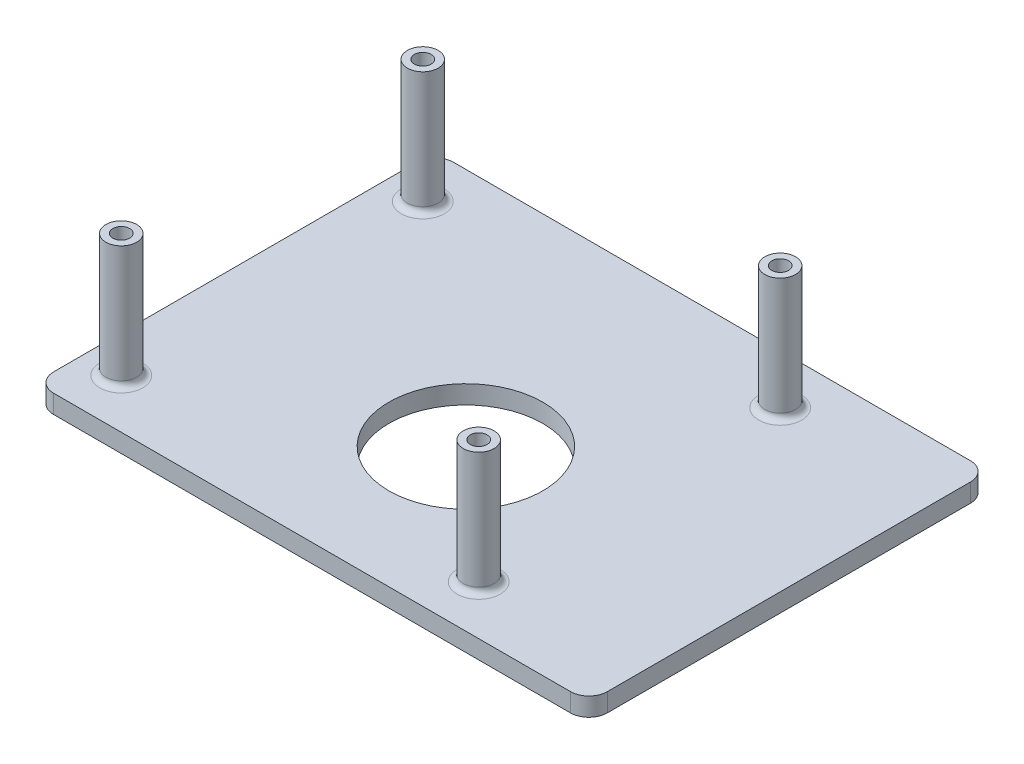
ISO-10303-21;
HEADER;
FILE_DESCRIPTION(('STEP AP214'),'2;1');
FILE_NAME('part.step','',(''),(''),'','','');
FILE_SCHEMA(('AUTOMOTIVE_DESIGN { 1 0 10303 214 1 1 1 1 }'));
ENDSEC;
DATA;
#1=APPLICATION_CONTEXT('core data for automotive mechanical design processes');
#2=APPLICATION_PROTOCOL_DEFINITION('international standard','automotive_design',2000,#1);
#3=PRODUCT_CONTEXT('',#1,'mechanical');
#4=PRODUCT('Part','Part','',(#3));
#5=PRODUCT_RELATED_PRODUCT_CATEGORY('part','',(#4));
#6=PRODUCT_DEFINITION_FORMATION('','',#4);
#7=PRODUCT_DEFINITION_CONTEXT('part definition',#1,'design');
#8=PRODUCT_DEFINITION('design','',#6,#7);
#9=PRODUCT_DEFINITION_SHAPE('','',#8);
#10=(LENGTH_UNIT() NAMED_UNIT(*) SI_UNIT(.MILLI.,.METRE.));
#11=(NAMED_UNIT(*) PLANE_ANGLE_UNIT() SI_UNIT($,.RADIAN.));
#12=(NAMED_UNIT(*) SI_UNIT($,.STERADIAN.) SOLID_ANGLE_UNIT());
#13=UNCERTAINTY_MEASURE_WITH_UNIT(LENGTH_MEASURE(1.E-05),#10,'distance_accuracy_value','');
#14=(GEOMETRIC_REPRESENTATION_CONTEXT(3) GLOBAL_UNCERTAINTY_ASSIGNED_CONTEXT((#13)) GLOBAL_UNIT_ASSIGNED_CONTEXT((#10,
#11,#12)) REPRESENTATION_CONTEXT('',''));
#15=CARTESIAN_POINT('',(0.,0.,0.));
#16=DIRECTION('',(0.,0.,1.));
#17=DIRECTION('',(1.,0.,0.));
#18=AXIS2_PLACEMENT_3D('',#15,#16,#17);
#19=CARTESIAN_POINT('',(-45.,3.,32.5));
#20=DIRECTION('',(0.,0.,-1.));
#21=DIRECTION('',(-1.,0.,0.));
#22=AXIS2_PLACEMENT_3D('',#19,#20,#21);
#23=PLANE('',#22);
#24=DIRECTION('',(1.,0.,0.));
#25=VECTOR('',#24,1.);
#26=CARTESIAN_POINT('',(-45.,3.,32.5));
#27=LINE('',#26,#25);
#28=CARTESIAN_POINT('',(-42.,3.,32.5));
#29=VERTEX_POINT('',#28);
#30=CARTESIAN_POINT('',(42.,3.,32.5));
#31=VERTEX_POINT('',#30);
#32=EDGE_CURVE('E135',#29,#31,#27,.T.);
#33=ORIENTED_EDGE('',*,*,#32,.F.);
#34=DIRECTION('',(0.,-1.,0.));
#35=VECTOR('',#34,1.);
#36=CARTESIAN_POINT('',(-42.,3.,32.5));
#37=LINE('',#36,#35);
#38=CARTESIAN_POINT('',(-42.,0.,32.5));
#39=VERTEX_POINT('',#38);
#40=EDGE_CURVE('E163',#29,#39,#37,.T.);
#41=ORIENTED_EDGE('',*,*,#40,.T.);
#42=DIRECTION('',(1.,0.,0.));
#43=VECTOR('',#42,1.);
#44=CARTESIAN_POINT('',(-45.,0.,32.5));
#45=LINE('',#44,#43);
#46=CARTESIAN_POINT('',(42.,0.,32.5));
#47=VERTEX_POINT('',#46);
#48=EDGE_CURVE('E137',#39,#47,#45,.T.);
#49=ORIENTED_EDGE('',*,*,#48,.T.);
#50=DIRECTION('',(0.,-1.,0.));
#51=VECTOR('',#50,1.);
#52=CARTESIAN_POINT('',(42.,3.,32.5));
#53=LINE('',#52,#51);
#54=EDGE_CURVE('E161',#47,#31,#53,.F.);
#55=ORIENTED_EDGE('',*,*,#54,.T.);
#56=EDGE_LOOP('',(#33,#41,#49,#55));
#57=FACE_BOUND('',#56,.T.);
#58=ADVANCED_FACE('F40',(#57),#23,.F.);
#59=CARTESIAN_POINT('',(45.,3.,32.5));
#60=DIRECTION('',(-1.,0.,0.));
#61=DIRECTION('',(0.,0.,1.));
#62=AXIS2_PLACEMENT_3D('',#59,#60,#61);
#63=PLANE('',#62);
#64=DIRECTION('',(0.,0.,-1.));
#65=VECTOR('',#64,1.);
#66=CARTESIAN_POINT('',(45.,0.,32.5));
#67=LINE('',#66,#65);
#68=CARTESIAN_POINT('',(45.,0.,29.5));
#69=VERTEX_POINT('',#68);
#70=CARTESIAN_POINT('',(45.,0.,-29.5));
#71=VERTEX_POINT('',#70);
#72=EDGE_CURVE('E133',#69,#71,#67,.T.);
#73=ORIENTED_EDGE('',*,*,#72,.T.);
#74=DIRECTION('',(0.,-1.,0.));
#75=VECTOR('',#74,1.);
#76=CARTESIAN_POINT('',(45.,3.,-29.5));
#77=LINE('',#76,#75);
#78=CARTESIAN_POINT('',(45.,3.,-29.5));
#79=VERTEX_POINT('',#78);
#80=EDGE_CURVE('E112',#71,#79,#77,.F.);
#81=ORIENTED_EDGE('',*,*,#80,.T.);
#82=DIRECTION('',(0.,0.,-1.));
#83=VECTOR('',#82,1.);
#84=CARTESIAN_POINT('',(45.,3.,32.5));
#85=LINE('',#84,#83);
#86=CARTESIAN_POINT('',(45.,3.,29.5));
#87=VERTEX_POINT('',#86);
#88=EDGE_CURVE('E265',#87,#79,#85,.T.);
#89=ORIENTED_EDGE('',*,*,#88,.F.);
#90=DIRECTION('',(0.,-1.,0.));
#91=VECTOR('',#90,1.);
#92=CARTESIAN_POINT('',(45.,3.,29.5));
#93=LINE('',#92,#91);
#94=EDGE_CURVE('E117',#87,#69,#93,.T.);
#95=ORIENTED_EDGE('',*,*,#94,.T.);
#96=EDGE_LOOP('',(#73,#81,#89,#95));
#97=FACE_BOUND('',#96,.T.);
#98=ADVANCED_FACE('F203',(#97),#63,.F.);
#99=CARTESIAN_POINT('',(-45.,3.,-32.5));
#100=DIRECTION('',(0.,0.,1.));
#101=DIRECTION('',(1.,0.,0.));
#102=AXIS2_PLACEMENT_3D('',#99,#100,#101);
#103=PLANE('',#102);
#104=DIRECTION('',(-1.,0.,0.));
#105=VECTOR('',#104,1.);
#106=CARTESIAN_POINT('',(-45.,3.,-32.5));
#107=LINE('',#106,#105);
#108=CARTESIAN_POINT('',(42.,3.,-32.5));
#109=VERTEX_POINT('',#108);
#110=CARTESIAN_POINT('',(-42.,3.,-32.5));
#111=VERTEX_POINT('',#110);
#112=EDGE_CURVE('E126',#109,#111,#107,.T.);
#113=ORIENTED_EDGE('',*,*,#112,.F.);
#114=DIRECTION('',(0.,-1.,0.));
#115=VECTOR('',#114,1.);
#116=CARTESIAN_POINT('',(42.,3.,-32.5));
#117=LINE('',#116,#115);
#118=CARTESIAN_POINT('',(42.,0.,-32.5));
#119=VERTEX_POINT('',#118);
#120=EDGE_CURVE('E111',#109,#119,#117,.T.);
#121=ORIENTED_EDGE('',*,*,#120,.T.);
#122=DIRECTION('',(-1.,0.,0.));
#123=VECTOR('',#122,1.);
#124=CARTESIAN_POINT('',(-45.,0.,-32.5));
#125=LINE('',#124,#123);
#126=CARTESIAN_POINT('',(-42.,0.,-32.5));
#127=VERTEX_POINT('',#126);
#128=EDGE_CURVE('E124',#119,#127,#125,.T.);
#129=ORIENTED_EDGE('',*,*,#128,.T.);
#130=DIRECTION('',(0.,-1.,0.));
#131=VECTOR('',#130,1.);
#132=CARTESIAN_POINT('',(-42.,3.,-32.5));
#133=LINE('',#132,#131);
#134=EDGE_CURVE('E128',#127,#111,#133,.F.);
#135=ORIENTED_EDGE('',*,*,#134,.T.);
#136=EDGE_LOOP('',(#113,#121,#129,#135));
#137=FACE_BOUND('',#136,.T.);
#138=ADVANCED_FACE('F123',(#137),#103,.F.);
#139=CARTESIAN_POINT('',(-45.,3.,32.5));
#140=DIRECTION('',(1.,0.,0.));
#141=DIRECTION('',(0.,0.,-1.));
#142=AXIS2_PLACEMENT_3D('',#139,#140,#141);
#143=PLANE('',#142);
#144=DIRECTION('',(0.,0.,1.));
#145=VECTOR('',#144,1.);
#146=CARTESIAN_POINT('',(-45.,3.,32.5));
#147=LINE('',#146,#145);
#148=CARTESIAN_POINT('',(-45.,3.,-29.5));
#149=VERTEX_POINT('',#148);
#150=CARTESIAN_POINT('',(-45.,3.,29.5));
#151=VERTEX_POINT('',#150);
#152=EDGE_CURVE('E141',#149,#151,#147,.T.);
#153=ORIENTED_EDGE('',*,*,#152,.F.);
#154=DIRECTION('',(0.,-1.,0.));
#155=VECTOR('',#154,1.);
#156=CARTESIAN_POINT('',(-45.,3.,-29.5));
#157=LINE('',#156,#155);
#158=CARTESIAN_POINT('',(-45.,0.,-29.5));
#159=VERTEX_POINT('',#158);
#160=EDGE_CURVE('E158',#149,#159,#157,.T.);
#161=ORIENTED_EDGE('',*,*,#160,.T.);
#162=DIRECTION('',(0.,0.,1.));
#163=VECTOR('',#162,1.);
#164=CARTESIAN_POINT('',(-45.,0.,32.5));
#165=LINE('',#164,#163);
#166=CARTESIAN_POINT('',(-45.,0.,29.5));
#167=VERTEX_POINT('',#166);
#168=EDGE_CURVE('E132',#159,#167,#165,.T.);
#169=ORIENTED_EDGE('',*,*,#168,.T.);
#170=DIRECTION('',(0.,-1.,0.));
#171=VECTOR('',#170,1.);
#172=CARTESIAN_POINT('',(-45.,3.,29.5));
#173=LINE('',#172,#171);
#174=EDGE_CURVE('E55',#167,#151,#173,.F.);
#175=ORIENTED_EDGE('',*,*,#174,.T.);
#176=EDGE_LOOP('',(#153,#161,#169,#175));
#177=FACE_BOUND('',#176,.T.);
#178=ADVANCED_FACE('F278',(#177),#143,.F.);
#179=CARTESIAN_POINT('',(0.,3.,0.));
#180=DIRECTION('',(0.,1.,0.));
#181=DIRECTION('',(0.,0.,1.));
#182=AXIS2_PLACEMENT_3D('',#179,#180,#181);
#183=PLANE('',#182);
#184=CARTESIAN_POINT('',(-1.00000000000001,3.,6.50000000000001));
#185=DIRECTION('',(0.,1.,0.));
#186=DIRECTION('',(0.,0.,1.));
#187=AXIS2_PLACEMENT_3D('',#184,#185,#186);
#188=CIRCLE('',#187,12.5003479994746);
#189=CARTESIAN_POINT('',(-1.00000000000001,3.,19.0003479994746));
#190=VERTEX_POINT('',#189);
#191=EDGE_CURVE('E337',#190,#190,#188,.T.);
#192=ORIENTED_EDGE('',*,*,#191,.F.);
#193=EDGE_LOOP('',(#192));
#194=FACE_BOUND('',#193,.T.);
#195=CARTESIAN_POINT('',(-39.,3.,24.5));
#196=DIRECTION('',(0.,1.,0.));
#197=DIRECTION('',(0.,0.,1.));
#198=AXIS2_PLACEMENT_3D('',#195,#196,#197);
#199=CIRCLE('',#198,3.5);
#200=CARTESIAN_POINT('',(-39.,3.,28.));
#201=VERTEX_POINT('',#200);
#202=EDGE_CURVE('E178',#201,#201,#199,.F.);
#203=ORIENTED_EDGE('',*,*,#202,.T.);
#204=EDGE_LOOP('',(#203));
#205=FACE_BOUND('',#204,.T.);
#206=CARTESIAN_POINT('',(19.08551248219,3.,24.5));
#207=DIRECTION('',(0.,1.,0.));
#208=DIRECTION('',(0.,0.,1.));
#209=AXIS2_PLACEMENT_3D('',#206,#207,#208);
#210=CIRCLE('',#209,3.5);
#211=CARTESIAN_POINT('',(19.08551248219,3.,28.));
#212=VERTEX_POINT('',#211);
#213=EDGE_CURVE('E175',#212,#212,#210,.F.);
#214=ORIENTED_EDGE('',*,*,#213,.T.);
#215=EDGE_LOOP('',(#214));
#216=FACE_BOUND('',#215,.T.);
#217=CARTESIAN_POINT('',(19.08551248219,3.,-24.5));
#218=DIRECTION('',(0.,1.,0.));
#219=DIRECTION('',(0.,0.,1.));
#220=AXIS2_PLACEMENT_3D('',#217,#218,#219);
#221=CIRCLE('',#220,3.5);
#222=CARTESIAN_POINT('',(19.08551248219,3.,-21.));
#223=VERTEX_POINT('',#222);
#224=EDGE_CURVE('E172',#223,#223,#221,.F.);
#225=ORIENTED_EDGE('',*,*,#224,.T.);
#226=EDGE_LOOP('',(#225));
#227=FACE_BOUND('',#226,.T.);
#228=CARTESIAN_POINT('',(-39.,3.,-24.5));
#229=DIRECTION('',(0.,1.,0.));
#230=DIRECTION('',(0.,0.,1.));
#231=AXIS2_PLACEMENT_3D('',#228,#229,#230);
#232=CIRCLE('',#231,3.5);
#233=CARTESIAN_POINT('',(-39.,3.,-21.));
#234=VERTEX_POINT('',#233);
#235=EDGE_CURVE('E169',#234,#234,#232,.F.);
#236=ORIENTED_EDGE('',*,*,#235,.T.);
#237=EDGE_LOOP('',(#236));
#238=FACE_BOUND('',#237,.T.);
#239=ORIENTED_EDGE('',*,*,#88,.T.);
#240=CARTESIAN_POINT('',(42.,3.,-29.5));
#241=DIRECTION('',(0.,1.,0.));
#242=DIRECTION('',(0.,0.,1.));
#243=AXIS2_PLACEMENT_3D('',#240,#241,#242);
#244=CIRCLE('',#243,3.);
#245=EDGE_CURVE('E155',#79,#109,#244,.T.);
#246=ORIENTED_EDGE('',*,*,#245,.T.);
#247=ORIENTED_EDGE('',*,*,#112,.T.);
#248=CARTESIAN_POINT('',(-42.,3.,-29.5));
#249=DIRECTION('',(0.,1.,0.));
#250=DIRECTION('',(0.,0.,1.));
#251=AXIS2_PLACEMENT_3D('',#248,#249,#250);
#252=CIRCLE('',#251,3.);
#253=EDGE_CURVE('E62',#111,#149,#252,.T.);
#254=ORIENTED_EDGE('',*,*,#253,.T.);
#255=ORIENTED_EDGE('',*,*,#152,.T.);
#256=CARTESIAN_POINT('',(-42.,3.,29.5));
#257=DIRECTION('',(0.,1.,0.));
#258=DIRECTION('',(0.,0.,1.));
#259=AXIS2_PLACEMENT_3D('',#256,#257,#258);
#260=CIRCLE('',#259,3.);
#261=EDGE_CURVE('E152',#151,#29,#260,.T.);
#262=ORIENTED_EDGE('',*,*,#261,.T.);
#263=ORIENTED_EDGE('',*,*,#32,.T.);
#264=CARTESIAN_POINT('',(42.,3.,29.5));
#265=DIRECTION('',(0.,1.,0.));
#266=DIRECTION('',(0.,0.,1.));
#267=AXIS2_PLACEMENT_3D('',#264,#265,#266);
#268=CIRCLE('',#267,3.);
#269=EDGE_CURVE('E150',#31,#87,#268,.T.);
#270=ORIENTED_EDGE('',*,*,#269,.T.);
#271=EDGE_LOOP('',(#239,#246,#247,#254,#255,#262,#263,#270));
#272=FACE_BOUND('',#271,.T.);
#273=ADVANCED_FACE('F276',(#194,#205,#216,#227,#238,#272),#183,.T.);
#274=CARTESIAN_POINT('',(0.,0.,0.));
#275=DIRECTION('',(0.,1.,0.));
#276=DIRECTION('',(0.,0.,1.));
#277=AXIS2_PLACEMENT_3D('',#274,#275,#276);
#278=PLANE('',#277);
#279=CARTESIAN_POINT('',(-1.00000000000001,0.,6.50000000000001));
#280=DIRECTION('',(0.,-1.,0.));
#281=DIRECTION('',(0.,0.,-1.));
#282=AXIS2_PLACEMENT_3D('',#279,#280,#281);
#283=CIRCLE('',#282,12.5003479994746);
#284=CARTESIAN_POINT('',(-1.00000000000001,0.,-6.00034799947463));
#285=VERTEX_POINT('',#284);
#286=EDGE_CURVE('E340',#285,#285,#283,.T.);
#287=ORIENTED_EDGE('',*,*,#286,.F.);
#288=EDGE_LOOP('',(#287));
#289=FACE_BOUND('',#288,.T.);
#290=CARTESIAN_POINT('',(19.08551248219,0.,24.5));
#291=DIRECTION('',(0.,1.,0.));
#292=DIRECTION('',(0.,0.,1.));
#293=AXIS2_PLACEMENT_3D('',#290,#291,#292);
#294=CIRCLE('',#293,1.36449971279399);
#295=CARTESIAN_POINT('',(19.08551248219,0.,25.864499712794));
#296=VERTEX_POINT('',#295);
#297=EDGE_CURVE('E357',#296,#296,#294,.T.);
#298=ORIENTED_EDGE('',*,*,#297,.T.);
#299=EDGE_LOOP('',(#298));
#300=FACE_BOUND('',#299,.T.);
#301=CARTESIAN_POINT('',(-39.,0.,24.5));
#302=DIRECTION('',(0.,1.,0.));
#303=DIRECTION('',(0.,0.,1.));
#304=AXIS2_PLACEMENT_3D('',#301,#302,#303);
#305=CIRCLE('',#304,1.364499712794);
#306=CARTESIAN_POINT('',(-39.,0.,25.864499712794));
#307=VERTEX_POINT('',#306);
#308=EDGE_CURVE('E351',#307,#307,#305,.T.);
#309=ORIENTED_EDGE('',*,*,#308,.T.);
#310=EDGE_LOOP('',(#309));
#311=FACE_BOUND('',#310,.T.);
#312=CARTESIAN_POINT('',(-39.,0.,-24.5));
#313=DIRECTION('',(0.,1.,0.));
#314=DIRECTION('',(0.,0.,1.));
#315=AXIS2_PLACEMENT_3D('',#312,#313,#314);
#316=CIRCLE('',#315,1.364499712794);
#317=CARTESIAN_POINT('',(-39.,0.,-23.135500287206));
#318=VERTEX_POINT('',#317);
#319=EDGE_CURVE('E345',#318,#318,#316,.T.);
#320=ORIENTED_EDGE('',*,*,#319,.T.);
#321=EDGE_LOOP('',(#320));
#322=FACE_BOUND('',#321,.T.);
#323=CARTESIAN_POINT('',(19.08551248219,0.,-24.5));
#324=DIRECTION('',(0.,1.,0.));
#325=DIRECTION('',(0.,0.,1.));
#326=AXIS2_PLACEMENT_3D('',#323,#324,#325);
#327=CIRCLE('',#326,1.36449971279399);
#328=CARTESIAN_POINT('',(19.08551248219,0.,-23.135500287206));
#329=VERTEX_POINT('',#328);
#330=EDGE_CURVE('E248',#329,#329,#327,.T.);
#331=ORIENTED_EDGE('',*,*,#330,.T.);
#332=EDGE_LOOP('',(#331));
#333=FACE_BOUND('',#332,.T.);
#334=ORIENTED_EDGE('',*,*,#128,.F.);
#335=CARTESIAN_POINT('',(42.,0.,-29.5));
#336=DIRECTION('',(0.,1.,0.));
#337=DIRECTION('',(0.,0.,1.));
#338=AXIS2_PLACEMENT_3D('',#335,#336,#337);
#339=CIRCLE('',#338,3.);
#340=EDGE_CURVE('E107',#119,#71,#339,.F.);
#341=ORIENTED_EDGE('',*,*,#340,.T.);
#342=ORIENTED_EDGE('',*,*,#72,.F.);
#343=CARTESIAN_POINT('',(42.,0.,29.5));
#344=DIRECTION('',(0.,1.,0.));
#345=DIRECTION('',(0.,0.,1.));
#346=AXIS2_PLACEMENT_3D('',#343,#344,#345);
#347=CIRCLE('',#346,3.);
#348=EDGE_CURVE('E127',#69,#47,#347,.F.);
#349=ORIENTED_EDGE('',*,*,#348,.T.);
#350=ORIENTED_EDGE('',*,*,#48,.F.);
#351=CARTESIAN_POINT('',(-42.,0.,29.5));
#352=DIRECTION('',(0.,1.,0.));
#353=DIRECTION('',(0.,0.,1.));
#354=AXIS2_PLACEMENT_3D('',#351,#352,#353);
#355=CIRCLE('',#354,3.);
#356=EDGE_CURVE('E144',#39,#167,#355,.F.);
#357=ORIENTED_EDGE('',*,*,#356,.T.);
#358=ORIENTED_EDGE('',*,*,#168,.F.);
#359=CARTESIAN_POINT('',(-42.,0.,-29.5));
#360=DIRECTION('',(0.,1.,0.));
#361=DIRECTION('',(0.,0.,1.));
#362=AXIS2_PLACEMENT_3D('',#359,#360,#361);
#363=CIRCLE('',#362,3.);
#364=EDGE_CURVE('E118',#159,#127,#363,.F.);
#365=ORIENTED_EDGE('',*,*,#364,.T.);
#366=EDGE_LOOP('',(#334,#341,#342,#349,#350,#357,#358,#365));
#367=FACE_BOUND('',#366,.T.);
#368=ADVANCED_FACE('F130',(#289,#300,#311,#322,#333,#367),#278,.F.);
#369=CARTESIAN_POINT('',(-39.,23.,-24.5));
#370=DIRECTION('',(0.,-1.,0.));
#371=DIRECTION('',(0.,0.,-1.));
#372=AXIS2_PLACEMENT_3D('',#369,#370,#371);
#373=CYLINDRICAL_SURFACE('',#372,2.5);
#374=CARTESIAN_POINT('',(-39.,4.,-24.5));
#375=DIRECTION('',(0.,1.,0.));
#376=DIRECTION('',(0.,0.,1.));
#377=AXIS2_PLACEMENT_3D('',#374,#375,#376);
#378=CIRCLE('',#377,2.5);
#379=CARTESIAN_POINT('',(-39.,4.,-22.));
#380=VERTEX_POINT('',#379);
#381=EDGE_CURVE('E11',#380,#380,#378,.T.);
#382=ORIENTED_EDGE('',*,*,#381,.T.);
#383=EDGE_LOOP('',(#382));
#384=FACE_BOUND('',#383,.T.);
#385=CARTESIAN_POINT('',(-39.,23.,-24.5));
#386=DIRECTION('',(0.,1.,0.));
#387=DIRECTION('',(0.,0.,1.));
#388=AXIS2_PLACEMENT_3D('',#385,#386,#387);
#389=CIRCLE('',#388,2.5);
#390=CARTESIAN_POINT('',(-39.,23.,-22.));
#391=VERTEX_POINT('',#390);
#392=EDGE_CURVE('E260',#391,#391,#389,.T.);
#393=ORIENTED_EDGE('',*,*,#392,.F.);
#394=EDGE_LOOP('',(#393));
#395=FACE_BOUND('',#394,.T.);
#396=ADVANCED_FACE('F289',(#384,#395),#373,.T.);
#397=CARTESIAN_POINT('',(-39.,23.,-24.5));
#398=DIRECTION('',(0.,1.,0.));
#399=DIRECTION('',(0.,0.,1.));
#400=AXIS2_PLACEMENT_3D('',#397,#398,#399);
#401=PLANE('',#400);
#402=CARTESIAN_POINT('',(-39.,23.,-24.5));
#403=DIRECTION('',(0.,1.,0.));
#404=DIRECTION('',(0.,0.,1.));
#405=AXIS2_PLACEMENT_3D('',#402,#403,#404);
#406=CIRCLE('',#405,1.364499712794);
#407=CARTESIAN_POINT('',(-39.,23.,-23.135500287206));
#408=VERTEX_POINT('',#407);
#409=EDGE_CURVE('E348',#408,#408,#406,.T.);
#410=ORIENTED_EDGE('',*,*,#409,.F.);
#411=EDGE_LOOP('',(#410));
#412=FACE_BOUND('',#411,.T.);
#413=ORIENTED_EDGE('',*,*,#392,.T.);
#414=EDGE_LOOP('',(#413));
#415=FACE_BOUND('',#414,.T.);
#416=ADVANCED_FACE('F294',(#412,#415),#401,.T.);
#417=CARTESIAN_POINT('',(19.08551248219,23.,-24.5));
#418=DIRECTION('',(0.,-1.,0.));
#419=DIRECTION('',(0.,0.,-1.));
#420=AXIS2_PLACEMENT_3D('',#417,#418,#419);
#421=CYLINDRICAL_SURFACE('',#420,2.5);
#422=CARTESIAN_POINT('',(19.08551248219,4.,-24.5));
#423=DIRECTION('',(0.,1.,0.));
#424=DIRECTION('',(0.,0.,1.));
#425=AXIS2_PLACEMENT_3D('',#422,#423,#424);
#426=CIRCLE('',#425,2.5);
#427=CARTESIAN_POINT('',(19.08551248219,4.,-22.));
#428=VERTEX_POINT('',#427);
#429=EDGE_CURVE('E48',#428,#428,#426,.T.);
#430=ORIENTED_EDGE('',*,*,#429,.T.);
#431=EDGE_LOOP('',(#430));
#432=FACE_BOUND('',#431,.T.);
#433=CARTESIAN_POINT('',(19.08551248219,23.,-24.5));
#434=DIRECTION('',(0.,1.,0.));
#435=DIRECTION('',(0.,0.,1.));
#436=AXIS2_PLACEMENT_3D('',#433,#434,#435);
#437=CIRCLE('',#436,2.5);
#438=CARTESIAN_POINT('',(19.08551248219,23.,-22.));
#439=VERTEX_POINT('',#438);
#440=EDGE_CURVE('E251',#439,#439,#437,.T.);
#441=ORIENTED_EDGE('',*,*,#440,.F.);
#442=EDGE_LOOP('',(#441));
#443=FACE_BOUND('',#442,.T.);
#444=ADVANCED_FACE('F186',(#432,#443),#421,.T.);
#445=CARTESIAN_POINT('',(19.08551248219,23.,-24.5));
#446=DIRECTION('',(0.,1.,0.));
#447=DIRECTION('',(0.,0.,1.));
#448=AXIS2_PLACEMENT_3D('',#445,#446,#447);
#449=PLANE('',#448);
#450=CARTESIAN_POINT('',(19.08551248219,23.,-24.5));
#451=DIRECTION('',(0.,1.,0.));
#452=DIRECTION('',(0.,0.,1.));
#453=AXIS2_PLACEMENT_3D('',#450,#451,#452);
#454=CIRCLE('',#453,1.36449971279399);
#455=CARTESIAN_POINT('',(19.08551248219,23.,-23.135500287206));
#456=VERTEX_POINT('',#455);
#457=EDGE_CURVE('E254',#456,#456,#454,.T.);
#458=ORIENTED_EDGE('',*,*,#457,.F.);
#459=EDGE_LOOP('',(#458));
#460=FACE_BOUND('',#459,.T.);
#461=ORIENTED_EDGE('',*,*,#440,.T.);
#462=EDGE_LOOP('',(#461));
#463=FACE_BOUND('',#462,.T.);
#464=ADVANCED_FACE('F301',(#460,#463),#449,.T.);
#465=CARTESIAN_POINT('',(19.08551248219,23.,24.5));
#466=DIRECTION('',(0.,-1.,0.));
#467=DIRECTION('',(0.,0.,-1.));
#468=AXIS2_PLACEMENT_3D('',#465,#466,#467);
#469=CYLINDRICAL_SURFACE('',#468,2.5);
#470=CARTESIAN_POINT('',(19.08551248219,4.,24.5));
#471=DIRECTION('',(0.,1.,0.));
#472=DIRECTION('',(0.,0.,1.));
#473=AXIS2_PLACEMENT_3D('',#470,#471,#472);
#474=CIRCLE('',#473,2.5);
#475=CARTESIAN_POINT('',(19.08551248219,4.,27.));
#476=VERTEX_POINT('',#475);
#477=EDGE_CURVE('E181',#476,#476,#474,.T.);
#478=ORIENTED_EDGE('',*,*,#477,.T.);
#479=EDGE_LOOP('',(#478));
#480=FACE_BOUND('',#479,.T.);
#481=CARTESIAN_POINT('',(19.08551248219,23.,24.5));
#482=DIRECTION('',(0.,1.,0.));
#483=DIRECTION('',(0.,0.,1.));
#484=AXIS2_PLACEMENT_3D('',#481,#482,#483);
#485=CIRCLE('',#484,2.5);
#486=CARTESIAN_POINT('',(19.08551248219,23.,27.));
#487=VERTEX_POINT('',#486);
#488=EDGE_CURVE('E247',#487,#487,#485,.T.);
#489=ORIENTED_EDGE('',*,*,#488,.F.);
#490=EDGE_LOOP('',(#489));
#491=FACE_BOUND('',#490,.T.);
#492=ADVANCED_FACE('F304',(#480,#491),#469,.T.);
#493=CARTESIAN_POINT('',(19.08551248219,23.,24.5));
#494=DIRECTION('',(0.,1.,0.));
#495=DIRECTION('',(0.,0.,1.));
#496=AXIS2_PLACEMENT_3D('',#493,#494,#495);
#497=PLANE('',#496);
#498=CARTESIAN_POINT('',(19.08551248219,23.,24.5));
#499=DIRECTION('',(0.,1.,0.));
#500=DIRECTION('',(0.,0.,1.));
#501=AXIS2_PLACEMENT_3D('',#498,#499,#500);
#502=CIRCLE('',#501,1.36449971279399);
#503=CARTESIAN_POINT('',(19.08551248219,23.,25.864499712794));
#504=VERTEX_POINT('',#503);
#505=EDGE_CURVE('E342',#504,#504,#502,.T.);
#506=ORIENTED_EDGE('',*,*,#505,.F.);
#507=EDGE_LOOP('',(#506));
#508=FACE_BOUND('',#507,.T.);
#509=ORIENTED_EDGE('',*,*,#488,.T.);
#510=EDGE_LOOP('',(#509));
#511=FACE_BOUND('',#510,.T.);
#512=ADVANCED_FACE('F241',(#508,#511),#497,.T.);
#513=CARTESIAN_POINT('',(-39.,23.,24.5));
#514=DIRECTION('',(0.,-1.,0.));
#515=DIRECTION('',(0.,0.,-1.));
#516=AXIS2_PLACEMENT_3D('',#513,#514,#515);
#517=CYLINDRICAL_SURFACE('',#516,2.5);
#518=CARTESIAN_POINT('',(-39.,4.,24.5));
#519=DIRECTION('',(0.,1.,0.));
#520=DIRECTION('',(0.,0.,1.));
#521=AXIS2_PLACEMENT_3D('',#518,#519,#520);
#522=CIRCLE('',#521,2.5);
#523=CARTESIAN_POINT('',(-39.,4.,27.));
#524=VERTEX_POINT('',#523);
#525=EDGE_CURVE('E166',#524,#524,#522,.T.);
#526=ORIENTED_EDGE('',*,*,#525,.T.);
#527=EDGE_LOOP('',(#526));
#528=FACE_BOUND('',#527,.T.);
#529=CARTESIAN_POINT('',(-39.,23.,24.5));
#530=DIRECTION('',(0.,1.,0.));
#531=DIRECTION('',(0.,0.,1.));
#532=AXIS2_PLACEMENT_3D('',#529,#530,#531);
#533=CIRCLE('',#532,2.5);
#534=CARTESIAN_POINT('',(-39.,23.,27.));
#535=VERTEX_POINT('',#534);
#536=EDGE_CURVE('E245',#535,#535,#533,.T.);
#537=ORIENTED_EDGE('',*,*,#536,.F.);
#538=EDGE_LOOP('',(#537));
#539=FACE_BOUND('',#538,.T.);
#540=ADVANCED_FACE('F237',(#528,#539),#517,.T.);
#541=CARTESIAN_POINT('',(-39.,23.,24.5));
#542=DIRECTION('',(0.,1.,0.));
#543=DIRECTION('',(0.,0.,1.));
#544=AXIS2_PLACEMENT_3D('',#541,#542,#543);
#545=PLANE('',#544);
#546=CARTESIAN_POINT('',(-39.,23.,24.5));
#547=DIRECTION('',(0.,1.,0.));
#548=DIRECTION('',(0.,0.,1.));
#549=AXIS2_PLACEMENT_3D('',#546,#547,#548);
#550=CIRCLE('',#549,1.364499712794);
#551=CARTESIAN_POINT('',(-39.,23.,25.864499712794));
#552=VERTEX_POINT('',#551);
#553=EDGE_CURVE('E354',#552,#552,#550,.T.);
#554=ORIENTED_EDGE('',*,*,#553,.F.);
#555=EDGE_LOOP('',(#554));
#556=FACE_BOUND('',#555,.T.);
#557=ORIENTED_EDGE('',*,*,#536,.T.);
#558=EDGE_LOOP('',(#557));
#559=FACE_BOUND('',#558,.T.);
#560=ADVANCED_FACE('F240',(#556,#559),#545,.T.);
#561=CARTESIAN_POINT('',(-39.,0.,24.5));
#562=DIRECTION('',(0.,1.,0.));
#563=DIRECTION('',(0.,0.,1.));
#564=AXIS2_PLACEMENT_3D('',#561,#562,#563);
#565=CYLINDRICAL_SURFACE('',#564,1.364499712794);
#566=ORIENTED_EDGE('',*,*,#308,.F.);
#567=EDGE_LOOP('',(#566));
#568=FACE_BOUND('',#567,.T.);
#569=ORIENTED_EDGE('',*,*,#553,.T.);
#570=EDGE_LOOP('',(#569));
#571=FACE_BOUND('',#570,.T.);
#572=ADVANCED_FACE('F313',(#568,#571),#565,.F.);
#573=CARTESIAN_POINT('',(19.08551248219,0.,24.5));
#574=DIRECTION('',(0.,1.,0.));
#575=DIRECTION('',(0.,0.,1.));
#576=AXIS2_PLACEMENT_3D('',#573,#574,#575);
#577=CYLINDRICAL_SURFACE('',#576,1.36449971279399);
#578=ORIENTED_EDGE('',*,*,#297,.F.);
#579=EDGE_LOOP('',(#578));
#580=FACE_BOUND('',#579,.T.);
#581=ORIENTED_EDGE('',*,*,#505,.T.);
#582=EDGE_LOOP('',(#581));
#583=FACE_BOUND('',#582,.T.);
#584=ADVANCED_FACE('F318',(#580,#583),#577,.F.);
#585=CARTESIAN_POINT('',(19.08551248219,0.,-24.5));
#586=DIRECTION('',(0.,1.,0.));
#587=DIRECTION('',(0.,0.,1.));
#588=AXIS2_PLACEMENT_3D('',#585,#586,#587);
#589=CYLINDRICAL_SURFACE('',#588,1.36449971279399);
#590=ORIENTED_EDGE('',*,*,#330,.F.);
#591=EDGE_LOOP('',(#590));
#592=FACE_BOUND('',#591,.T.);
#593=ORIENTED_EDGE('',*,*,#457,.T.);
#594=EDGE_LOOP('',(#593));
#595=FACE_BOUND('',#594,.T.);
#596=ADVANCED_FACE('F315',(#592,#595),#589,.F.);
#597=CARTESIAN_POINT('',(-39.,0.,-24.5));
#598=DIRECTION('',(0.,1.,0.));
#599=DIRECTION('',(0.,0.,1.));
#600=AXIS2_PLACEMENT_3D('',#597,#598,#599);
#601=CYLINDRICAL_SURFACE('',#600,1.364499712794);
#602=ORIENTED_EDGE('',*,*,#319,.F.);
#603=EDGE_LOOP('',(#602));
#604=FACE_BOUND('',#603,.T.);
#605=ORIENTED_EDGE('',*,*,#409,.T.);
#606=EDGE_LOOP('',(#605));
#607=FACE_BOUND('',#606,.T.);
#608=ADVANCED_FACE('F217',(#604,#607),#601,.F.);
#609=CARTESIAN_POINT('',(42.,3.,-29.5));
#610=DIRECTION('',(0.,-1.,0.));
#611=DIRECTION('',(0.,0.,-1.));
#612=AXIS2_PLACEMENT_3D('',#609,#610,#611);
#613=CYLINDRICAL_SURFACE('',#612,3.);
#614=ORIENTED_EDGE('',*,*,#245,.F.);
#615=ORIENTED_EDGE('',*,*,#80,.F.);
#616=ORIENTED_EDGE('',*,*,#340,.F.);
#617=ORIENTED_EDGE('',*,*,#120,.F.);
#618=EDGE_LOOP('',(#614,#615,#616,#617));
#619=FACE_BOUND('',#618,.T.);
#620=ADVANCED_FACE('F110',(#619),#613,.T.);
#621=CARTESIAN_POINT('',(-42.,3.,-29.5));
#622=DIRECTION('',(0.,-1.,0.));
#623=DIRECTION('',(0.,0.,-1.));
#624=AXIS2_PLACEMENT_3D('',#621,#622,#623);
#625=CYLINDRICAL_SURFACE('',#624,3.);
#626=ORIENTED_EDGE('',*,*,#253,.F.);
#627=ORIENTED_EDGE('',*,*,#134,.F.);
#628=ORIENTED_EDGE('',*,*,#364,.F.);
#629=ORIENTED_EDGE('',*,*,#160,.F.);
#630=EDGE_LOOP('',(#626,#627,#628,#629));
#631=FACE_BOUND('',#630,.T.);
#632=ADVANCED_FACE('F216',(#631),#625,.T.);
#633=CARTESIAN_POINT('',(-42.,3.,29.5));
#634=DIRECTION('',(0.,-1.,0.));
#635=DIRECTION('',(0.,0.,-1.));
#636=AXIS2_PLACEMENT_3D('',#633,#634,#635);
#637=CYLINDRICAL_SURFACE('',#636,3.);
#638=ORIENTED_EDGE('',*,*,#261,.F.);
#639=ORIENTED_EDGE('',*,*,#174,.F.);
#640=ORIENTED_EDGE('',*,*,#356,.F.);
#641=ORIENTED_EDGE('',*,*,#40,.F.);
#642=EDGE_LOOP('',(#638,#639,#640,#641));
#643=FACE_BOUND('',#642,.T.);
#644=ADVANCED_FACE('F220',(#643),#637,.T.);
#645=CARTESIAN_POINT('',(42.,3.,29.5));
#646=DIRECTION('',(0.,-1.,0.));
#647=DIRECTION('',(0.,0.,-1.));
#648=AXIS2_PLACEMENT_3D('',#645,#646,#647);
#649=CYLINDRICAL_SURFACE('',#648,3.);
#650=ORIENTED_EDGE('',*,*,#269,.F.);
#651=ORIENTED_EDGE('',*,*,#54,.F.);
#652=ORIENTED_EDGE('',*,*,#348,.F.);
#653=ORIENTED_EDGE('',*,*,#94,.F.);
#654=EDGE_LOOP('',(#650,#651,#652,#653));
#655=FACE_BOUND('',#654,.T.);
#656=ADVANCED_FACE('F224',(#655),#649,.T.);
#657=CARTESIAN_POINT('',(-39.,4.,24.5));
#658=DIRECTION('',(0.,1.,0.));
#659=DIRECTION('',(0.,0.,1.));
#660=AXIS2_PLACEMENT_3D('',#657,#658,#659);
#661=TOROIDAL_SURFACE('',#660,3.5,1.);
#662=ORIENTED_EDGE('',*,*,#202,.F.);
#663=EDGE_LOOP('',(#662));
#664=FACE_BOUND('',#663,.T.);
#665=ORIENTED_EDGE('',*,*,#525,.F.);
#666=EDGE_LOOP('',(#665));
#667=FACE_BOUND('',#666,.T.);
#668=ADVANCED_FACE('F198',(#664,#667),#661,.F.);
#669=CARTESIAN_POINT('',(19.08551248219,4.,24.5));
#670=DIRECTION('',(0.,1.,0.));
#671=DIRECTION('',(0.,0.,1.));
#672=AXIS2_PLACEMENT_3D('',#669,#670,#671);
#673=TOROIDAL_SURFACE('',#672,3.5,1.);
#674=ORIENTED_EDGE('',*,*,#213,.F.);
#675=EDGE_LOOP('',(#674));
#676=FACE_BOUND('',#675,.T.);
#677=ORIENTED_EDGE('',*,*,#477,.F.);
#678=EDGE_LOOP('',(#677));
#679=FACE_BOUND('',#678,.T.);
#680=ADVANCED_FACE('F191',(#676,#679),#673,.F.);
#681=CARTESIAN_POINT('',(19.08551248219,4.,-24.5));
#682=DIRECTION('',(0.,1.,0.));
#683=DIRECTION('',(0.,0.,1.));
#684=AXIS2_PLACEMENT_3D('',#681,#682,#683);
#685=TOROIDAL_SURFACE('',#684,3.5,1.);
#686=ORIENTED_EDGE('',*,*,#224,.F.);
#687=EDGE_LOOP('',(#686));
#688=FACE_BOUND('',#687,.T.);
#689=ORIENTED_EDGE('',*,*,#429,.F.);
#690=EDGE_LOOP('',(#689));
#691=FACE_BOUND('',#690,.T.);
#692=ADVANCED_FACE('F189',(#688,#691),#685,.F.);
#693=CARTESIAN_POINT('',(-39.,4.,-24.5));
#694=DIRECTION('',(0.,1.,0.));
#695=DIRECTION('',(0.,0.,1.));
#696=AXIS2_PLACEMENT_3D('',#693,#694,#695);
#697=TOROIDAL_SURFACE('',#696,3.5,1.);
#698=ORIENTED_EDGE('',*,*,#235,.F.);
#699=EDGE_LOOP('',(#698));
#700=FACE_BOUND('',#699,.T.);
#701=ORIENTED_EDGE('',*,*,#381,.F.);
#702=EDGE_LOOP('',(#701));
#703=FACE_BOUND('',#702,.T.);
#704=ADVANCED_FACE('F42',(#700,#703),#697,.F.);
#705=CARTESIAN_POINT('',(-1.00000000000001,23.,6.50000000000001));
#706=DIRECTION('',(0.,-1.,0.));
#707=DIRECTION('',(0.,0.,-1.));
#708=AXIS2_PLACEMENT_3D('',#705,#706,#707);
#709=CYLINDRICAL_SURFACE('',#708,12.5003479994746);
#710=ORIENTED_EDGE('',*,*,#191,.T.);
#711=EDGE_LOOP('',(#710));
#712=FACE_BOUND('',#711,.T.);
#713=ORIENTED_EDGE('',*,*,#286,.T.);
#714=EDGE_LOOP('',(#713));
#715=FACE_BOUND('',#714,.T.);
#716=ADVANCED_FACE('F196',(#712,#715),#709,.F.);
#717=CLOSED_SHELL('',(#58,#98,#138,#178,#273,#368,#396,#416,#444,#464,#492,#512,#540,#560,#572,
#584,#596,#608,#620,#632,#644,#656,#668,#680,#692,#704,#716));
#718=MANIFOLD_SOLID_BREP('B2',#717);
#719=ADVANCED_BREP_SHAPE_REPRESENTATION('',(#18,#718),#14);
#720=SHAPE_DEFINITION_REPRESENTATION(#9,#719);
ENDSEC;
END-ISO-10303-21;
